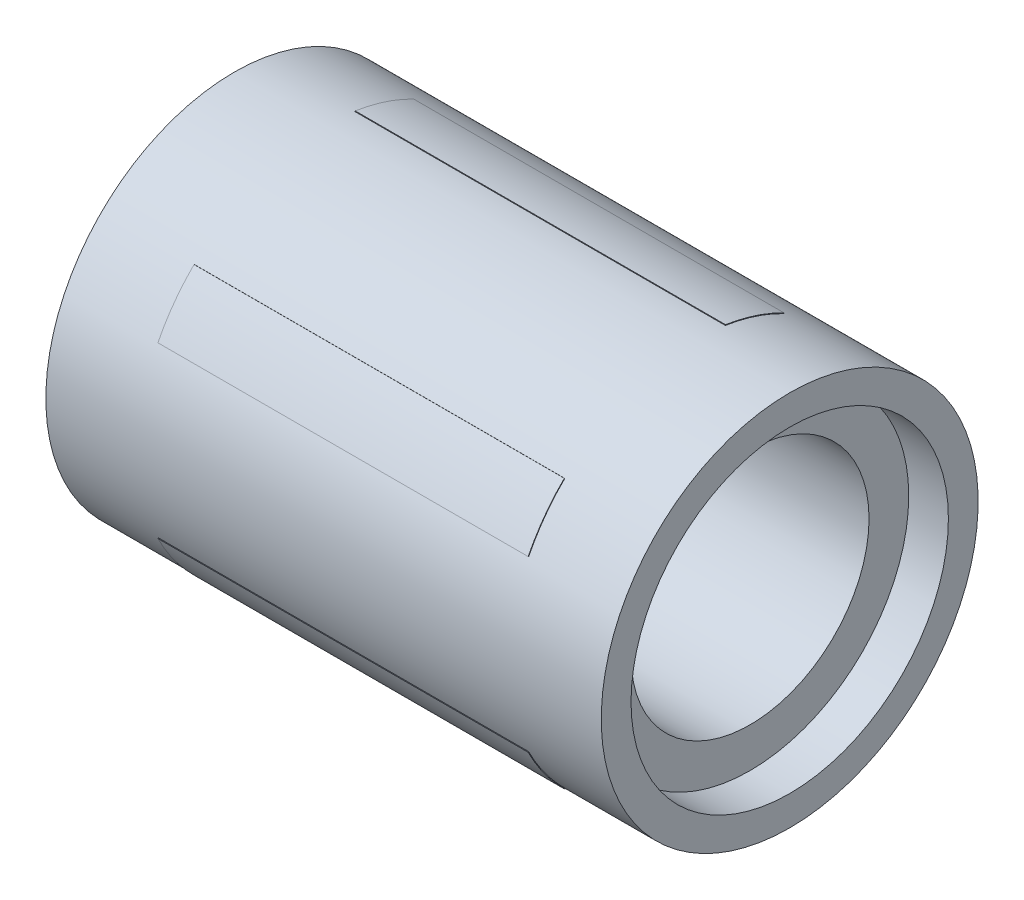
ISO-10303-21;
HEADER;
FILE_DESCRIPTION(('STEP AP214'),'2;1');
FILE_NAME('part.step','',(''),(''),'','','');
FILE_SCHEMA(('AUTOMOTIVE_DESIGN { 1 0 10303 214 1 1 1 1 }'));
ENDSEC;
DATA;
#1=APPLICATION_CONTEXT('core data for automotive mechanical design processes');
#2=APPLICATION_PROTOCOL_DEFINITION('international standard','automotive_design',2000,#1);
#3=PRODUCT_CONTEXT('',#1,'mechanical');
#4=PRODUCT('Part','Part','',(#3));
#5=PRODUCT_RELATED_PRODUCT_CATEGORY('part','',(#4));
#6=PRODUCT_DEFINITION_FORMATION('','',#4);
#7=PRODUCT_DEFINITION_CONTEXT('part definition',#1,'design');
#8=PRODUCT_DEFINITION('design','',#6,#7);
#9=PRODUCT_DEFINITION_SHAPE('','',#8);
#10=(LENGTH_UNIT() NAMED_UNIT(*) SI_UNIT(.MILLI.,.METRE.));
#11=(NAMED_UNIT(*) PLANE_ANGLE_UNIT() SI_UNIT($,.RADIAN.));
#12=(NAMED_UNIT(*) SI_UNIT($,.STERADIAN.) SOLID_ANGLE_UNIT());
#13=UNCERTAINTY_MEASURE_WITH_UNIT(LENGTH_MEASURE(1.E-05),#10,'distance_accuracy_value','');
#14=(GEOMETRIC_REPRESENTATION_CONTEXT(3) GLOBAL_UNCERTAINTY_ASSIGNED_CONTEXT((#13)) GLOBAL_UNIT_ASSIGNED_CONTEXT((#10,
#11,#12)) REPRESENTATION_CONTEXT('',''));
#15=CARTESIAN_POINT('',(0.,0.,0.));
#16=DIRECTION('',(0.,0.,1.));
#17=DIRECTION('',(1.,0.,0.));
#18=AXIS2_PLACEMENT_3D('',#15,#16,#17);
#19=CARTESIAN_POINT('',(-9.33333333333333,-1.55,-9.53094380169321));
#20=DIRECTION('',(-1.,0.,0.));
#21=DIRECTION('',(0.,0.,1.));
#22=AXIS2_PLACEMENT_3D('',#19,#20,#21);
#23=PLANE('',#22);
#24=DIRECTION('',(0.,0.,1.));
#25=VECTOR('',#24,1.);
#26=CARTESIAN_POINT('',(-9.33333333333333,-1.55,-9.45134985889871));
#27=LINE('',#26,#25);
#28=CARTESIAN_POINT('',(-9.33333333333333,-1.55,-9.40310586987087));
#29=VERTEX_POINT('',#28);
#30=CARTESIAN_POINT('',(-9.33333333333329,-1.55000000000001,-9.37269971779743));
#31=VERTEX_POINT('',#30);
#32=EDGE_CURVE('E159',#29,#31,#27,.T.);
#33=ORIENTED_EDGE('',*,*,#32,.T.);
#34=CARTESIAN_POINT('',(-9.33333333333324,0.,0.));
#35=DIRECTION('',(1.,0.,0.));
#36=DIRECTION('',(0.,1.,0.));
#37=AXIS2_PLACEMENT_3D('',#34,#35,#36);
#38=CIRCLE('',#37,9.5);
#39=CARTESIAN_POINT('',(-9.33333333333329,1.55,-9.37269971779743));
#40=VERTEX_POINT('',#39);
#41=EDGE_CURVE('E20',#31,#40,#38,.T.);
#42=ORIENTED_EDGE('',*,*,#41,.T.);
#43=DIRECTION('',(0.,0.,-1.));
#44=VECTOR('',#43,1.);
#45=CARTESIAN_POINT('',(-9.33333333333333,1.55,-9.45134985889871));
#46=LINE('',#45,#44);
#47=CARTESIAN_POINT('',(-9.33333333333333,1.55,-9.40310586987087));
#48=VERTEX_POINT('',#47);
#49=EDGE_CURVE('E157',#40,#48,#46,.T.);
#50=ORIENTED_EDGE('',*,*,#49,.T.);
#51=CARTESIAN_POINT('',(-9.33333333333333,0.,0.));
#52=DIRECTION('',(-1.,0.,0.));
#53=DIRECTION('',(0.,0.,1.));
#54=AXIS2_PLACEMENT_3D('',#51,#52,#53);
#55=CIRCLE('',#54,9.53000000000008);
#56=EDGE_CURVE('E262',#29,#48,#55,.F.);
#57=ORIENTED_EDGE('',*,*,#56,.F.);
#58=EDGE_LOOP('',(#33,#42,#50,#57));
#59=FACE_BOUND('',#58,.T.);
#60=ADVANCED_FACE('F17',(#59),#23,.T.);
#61=CARTESIAN_POINT('',(9.33333333333333,-1.55,-9.37175591610421));
#62=DIRECTION('',(1.,0.,0.));
#63=DIRECTION('',(0.,0.,-1.));
#64=AXIS2_PLACEMENT_3D('',#61,#62,#63);
#65=PLANE('',#64);
#66=DIRECTION('',(0.,0.,-1.));
#67=VECTOR('',#66,1.);
#68=CARTESIAN_POINT('',(9.33333333333333,-1.55,-9.45134985889871));
#69=LINE('',#68,#67);
#70=CARTESIAN_POINT('',(9.33333333333328,-1.55000000000001,-9.37269971779743));
#71=VERTEX_POINT('',#70);
#72=CARTESIAN_POINT('',(9.33333333333333,-1.55,-9.40310586987087));
#73=VERTEX_POINT('',#72);
#74=EDGE_CURVE('E266',#71,#73,#69,.T.);
#75=ORIENTED_EDGE('',*,*,#74,.T.);
#76=CARTESIAN_POINT('',(9.33333333333333,0.,0.));
#77=DIRECTION('',(-1.,0.,0.));
#78=DIRECTION('',(0.,0.,1.));
#79=AXIS2_PLACEMENT_3D('',#76,#77,#78);
#80=CIRCLE('',#79,9.53000000000008);
#81=CARTESIAN_POINT('',(9.33333333333333,1.55,-9.40310586987087));
#82=VERTEX_POINT('',#81);
#83=EDGE_CURVE('E259',#82,#73,#80,.T.);
#84=ORIENTED_EDGE('',*,*,#83,.F.);
#85=DIRECTION('',(0.,0.,1.));
#86=VECTOR('',#85,1.);
#87=CARTESIAN_POINT('',(9.33333333333333,1.55,-9.45134985889871));
#88=LINE('',#87,#86);
#89=CARTESIAN_POINT('',(9.33333333333328,1.55,-9.37269971779743));
#90=VERTEX_POINT('',#89);
#91=EDGE_CURVE('E160',#82,#90,#88,.T.);
#92=ORIENTED_EDGE('',*,*,#91,.T.);
#93=CARTESIAN_POINT('',(9.33333333333324,0.,0.));
#94=DIRECTION('',(1.,0.,0.));
#95=DIRECTION('',(0.,1.,0.));
#96=AXIS2_PLACEMENT_3D('',#93,#94,#95);
#97=CIRCLE('',#96,9.5);
#98=EDGE_CURVE('E173',#90,#71,#97,.F.);
#99=ORIENTED_EDGE('',*,*,#98,.T.);
#100=EDGE_LOOP('',(#75,#84,#92,#99));
#101=FACE_BOUND('',#100,.T.);
#102=ADVANCED_FACE('F734',(#101),#65,.T.);
#103=CARTESIAN_POINT('',(12.,-8.09600000000001,8.096));
#104=DIRECTION('',(1.,0.,0.));
#105=DIRECTION('',(0.,0.,-1.));
#106=AXIS2_PLACEMENT_3D('',#103,#104,#105);
#107=PLANE('',#106);
#108=CARTESIAN_POINT('',(12.,0.,0.));
#109=DIRECTION('',(1.,0.,0.));
#110=DIRECTION('',(0.,0.,-1.));
#111=AXIS2_PLACEMENT_3D('',#108,#109,#110);
#112=CIRCLE('',#111,6.);
#113=CARTESIAN_POINT('',(12.,0.,-6.));
#114=VERTEX_POINT('',#113);
#115=EDGE_CURVE('E256',#114,#114,#112,.T.);
#116=ORIENTED_EDGE('',*,*,#115,.F.);
#117=EDGE_LOOP('',(#116));
#118=FACE_BOUND('',#117,.T.);
#119=CARTESIAN_POINT('',(12.,0.,0.));
#120=DIRECTION('',(1.,0.,0.));
#121=DIRECTION('',(0.,0.,-1.));
#122=AXIS2_PLACEMENT_3D('',#119,#120,#121);
#123=CIRCLE('',#122,8.);
#124=CARTESIAN_POINT('',(12.,0.,-8.));
#125=VERTEX_POINT('',#124);
#126=EDGE_CURVE('E264',#125,#125,#123,.F.);
#127=ORIENTED_EDGE('',*,*,#126,.F.);
#128=EDGE_LOOP('',(#127));
#129=FACE_BOUND('',#128,.T.);
#130=ADVANCED_FACE('F725',(#118,#129),#107,.T.);
#131=CARTESIAN_POINT('',(12.,0.,0.));
#132=DIRECTION('',(1.,0.,0.));
#133=DIRECTION('',(0.,0.,-1.));
#134=AXIS2_PLACEMENT_3D('',#131,#132,#133);
#135=CYLINDRICAL_SURFACE('',#134,8.);
#136=CARTESIAN_POINT('',(14.,0.,0.));
#137=DIRECTION('',(1.,0.,0.));
#138=DIRECTION('',(0.,0.,-1.));
#139=AXIS2_PLACEMENT_3D('',#136,#137,#138);
#140=CIRCLE('',#139,8.);
#141=CARTESIAN_POINT('',(14.,0.,-8.));
#142=VERTEX_POINT('',#141);
#143=EDGE_CURVE('E252',#142,#142,#140,.F.);
#144=ORIENTED_EDGE('',*,*,#143,.F.);
#145=EDGE_LOOP('',(#144));
#146=FACE_BOUND('',#145,.T.);
#147=ORIENTED_EDGE('',*,*,#126,.T.);
#148=EDGE_LOOP('',(#147));
#149=FACE_BOUND('',#148,.T.);
#150=ADVANCED_FACE('F359',(#146,#149),#135,.F.);
#151=CARTESIAN_POINT('',(-9.33333333333333,0.,0.));
#152=DIRECTION('',(-1.,0.,0.));
#153=DIRECTION('',(0.,0.,1.));
#154=AXIS2_PLACEMENT_3D('',#151,#152,#153);
#155=CYLINDRICAL_SURFACE('',#154,9.53000000000008);
#156=ORIENTED_EDGE('',*,*,#83,.T.);
#157=DIRECTION('',(1.,0.,0.));
#158=VECTOR('',#157,1.);
#159=CARTESIAN_POINT('',(-9.33333333333333,-1.55,-9.40310586987087));
#160=LINE('',#159,#158);
#161=EDGE_CURVE('E255',#29,#73,#160,.T.);
#162=ORIENTED_EDGE('',*,*,#161,.F.);
#163=ORIENTED_EDGE('',*,*,#56,.T.);
#164=DIRECTION('',(1.,0.,0.));
#165=VECTOR('',#164,1.);
#166=CARTESIAN_POINT('',(-9.33333333333333,1.55,-9.40310586987087));
#167=LINE('',#166,#165);
#168=EDGE_CURVE('E168',#82,#48,#167,.F.);
#169=ORIENTED_EDGE('',*,*,#168,.F.);
#170=EDGE_LOOP('',(#156,#162,#163,#169));
#171=FACE_BOUND('',#170,.T.);
#172=ADVANCED_FACE('F349',(#171),#155,.T.);
#173=CARTESIAN_POINT('',(-9.33333333333333,2.2E-13,0.));
#174=DIRECTION('',(-1.,0.,0.));
#175=DIRECTION('',(0.,0.,1.));
#176=AXIS2_PLACEMENT_3D('',#173,#174,#175);
#177=CYLINDRICAL_SURFACE('',#176,9.53000000000023);
#178=CARTESIAN_POINT('',(9.33333333333333,2.2E-13,0.));
#179=DIRECTION('',(-1.,0.,0.));
#180=DIRECTION('',(0.,0.,1.));
#181=AXIS2_PLACEMENT_3D('',#178,#179,#180);
#182=CIRCLE('',#181,9.53000000000023);
#183=CARTESIAN_POINT('',(9.33333333333333,-9.42186145223507,-1.43158191343943));
#184=VERTEX_POINT('',#183);
#185=CARTESIAN_POINT('',(9.33333333333333,-8.46390876967273,-4.37985711395441));
#186=VERTEX_POINT('',#185);
#187=EDGE_CURVE('E249',#184,#186,#182,.F.);
#188=ORIENTED_EDGE('',*,*,#187,.F.);
#189=DIRECTION('',(1.,0.,0.));
#190=VECTOR('',#189,1.);
#191=CARTESIAN_POINT('',(-9.33333333333334,-9.42186145223507,-1.43158191343943));
#192=LINE('',#191,#190);
#193=CARTESIAN_POINT('',(-9.33333333333334,-9.42186145223507,-1.43158191343943));
#194=VERTEX_POINT('',#193);
#195=EDGE_CURVE('E278',#194,#184,#192,.T.);
#196=ORIENTED_EDGE('',*,*,#195,.F.);
#197=CARTESIAN_POINT('',(-9.33333333333333,2.2E-13,0.));
#198=DIRECTION('',(-1.,0.,0.));
#199=DIRECTION('',(0.,0.,1.));
#200=AXIS2_PLACEMENT_3D('',#197,#198,#199);
#201=CIRCLE('',#200,9.53000000000023);
#202=CARTESIAN_POINT('',(-9.33333333333334,-8.46390876967273,-4.3798571139544));
#203=VERTEX_POINT('',#202);
#204=EDGE_CURVE('E245',#203,#194,#201,.T.);
#205=ORIENTED_EDGE('',*,*,#204,.F.);
#206=DIRECTION('',(1.,0.,0.));
#207=VECTOR('',#206,1.);
#208=CARTESIAN_POINT('',(-9.33333333333334,-8.46390876967273,-4.37985711395441));
#209=LINE('',#208,#207);
#210=EDGE_CURVE('E276',#186,#203,#209,.F.);
#211=ORIENTED_EDGE('',*,*,#210,.F.);
#212=EDGE_LOOP('',(#188,#196,#205,#211));
#213=FACE_BOUND('',#212,.T.);
#214=ADVANCED_FACE('F346',(#213),#177,.T.);
#215=CARTESIAN_POINT('',(-9.33333333333333,0.,0.));
#216=DIRECTION('',(-1.,0.,0.));
#217=DIRECTION('',(0.,0.,1.));
#218=AXIS2_PLACEMENT_3D('',#215,#216,#217);
#219=CYLINDRICAL_SURFACE('',#218,9.53000000000008);
#220=CARTESIAN_POINT('',(9.33333333333333,0.,0.));
#221=DIRECTION('',(-1.,0.,0.));
#222=DIRECTION('',(0.,0.,1.));
#223=AXIS2_PLACEMENT_3D('',#220,#221,#222);
#224=CIRCLE('',#223,9.53000000000008);
#225=CARTESIAN_POINT('',(9.33333333333333,-4.27303061477372,8.51833958968569));
#226=VERTEX_POINT('',#225);
#227=CARTESIAN_POINT('',(9.33333333333333,-6.78098329733605,6.69620530757903));
#228=VERTEX_POINT('',#227);
#229=EDGE_CURVE('E241',#226,#228,#224,.F.);
#230=ORIENTED_EDGE('',*,*,#229,.F.);
#231=DIRECTION('',(1.,0.,0.));
#232=VECTOR('',#231,1.);
#233=CARTESIAN_POINT('',(-9.33333333333333,-4.27303061477372,8.51833958968569));
#234=LINE('',#233,#232);
#235=CARTESIAN_POINT('',(-9.33333333333333,-4.27303061477372,8.51833958968569));
#236=VERTEX_POINT('',#235);
#237=EDGE_CURVE('E283',#236,#226,#234,.T.);
#238=ORIENTED_EDGE('',*,*,#237,.F.);
#239=CARTESIAN_POINT('',(-9.33333333333333,0.,0.));
#240=DIRECTION('',(-1.,0.,0.));
#241=DIRECTION('',(0.,0.,1.));
#242=AXIS2_PLACEMENT_3D('',#239,#240,#241);
#243=CIRCLE('',#242,9.53000000000008);
#244=CARTESIAN_POINT('',(-9.33333333333333,-6.78098329733606,6.69620530757902));
#245=VERTEX_POINT('',#244);
#246=EDGE_CURVE('E237',#245,#236,#243,.T.);
#247=ORIENTED_EDGE('',*,*,#246,.F.);
#248=DIRECTION('',(1.,0.,0.));
#249=VECTOR('',#248,1.);
#250=CARTESIAN_POINT('',(-9.33333333333333,-6.78098329733605,6.69620530757903));
#251=LINE('',#250,#249);
#252=EDGE_CURVE('E281',#228,#245,#251,.F.);
#253=ORIENTED_EDGE('',*,*,#252,.F.);
#254=EDGE_LOOP('',(#230,#238,#247,#253));
#255=FACE_BOUND('',#254,.T.);
#256=ADVANCED_FACE('F348',(#255),#219,.T.);
#257=CARTESIAN_POINT('',(-9.33333333333333,0.,0.));
#258=DIRECTION('',(-1.,0.,0.));
#259=DIRECTION('',(0.,0.,1.));
#260=AXIS2_PLACEMENT_3D('',#257,#258,#259);
#261=CYLINDRICAL_SURFACE('',#260,9.53000000000003);
#262=CARTESIAN_POINT('',(9.33333333333333,0.,0.));
#263=DIRECTION('',(-1.,0.,0.));
#264=DIRECTION('',(0.,0.,1.));
#265=AXIS2_PLACEMENT_3D('',#262,#263,#264);
#266=CIRCLE('',#265,9.53000000000003);
#267=CARTESIAN_POINT('',(9.33333333333333,6.78098329733605,6.69620530757902));
#268=VERTEX_POINT('',#267);
#269=CARTESIAN_POINT('',(9.33333333333333,4.27303061477371,8.51833958968569));
#270=VERTEX_POINT('',#269);
#271=EDGE_CURVE('E233',#268,#270,#266,.F.);
#272=ORIENTED_EDGE('',*,*,#271,.F.);
#273=DIRECTION('',(1.,0.,0.));
#274=VECTOR('',#273,1.);
#275=CARTESIAN_POINT('',(-9.33333333333334,6.78098329733605,6.69620530757902));
#276=LINE('',#275,#274);
#277=CARTESIAN_POINT('',(-9.33333333333334,6.78098329733605,6.69620530757902));
#278=VERTEX_POINT('',#277);
#279=EDGE_CURVE('E288',#278,#268,#276,.T.);
#280=ORIENTED_EDGE('',*,*,#279,.F.);
#281=CARTESIAN_POINT('',(-9.33333333333333,0.,0.));
#282=DIRECTION('',(-1.,0.,0.));
#283=DIRECTION('',(0.,0.,1.));
#284=AXIS2_PLACEMENT_3D('',#281,#282,#283);
#285=CIRCLE('',#284,9.53000000000003);
#286=CARTESIAN_POINT('',(-9.33333333333333,4.2730306147737,8.5183395896857));
#287=VERTEX_POINT('',#286);
#288=EDGE_CURVE('E229',#287,#278,#285,.T.);
#289=ORIENTED_EDGE('',*,*,#288,.F.);
#290=DIRECTION('',(1.,0.,0.));
#291=VECTOR('',#290,1.);
#292=CARTESIAN_POINT('',(-9.33333333333333,4.27303061477371,8.51833958968569));
#293=LINE('',#292,#291);
#294=EDGE_CURVE('E286',#270,#287,#293,.F.);
#295=ORIENTED_EDGE('',*,*,#294,.F.);
#296=EDGE_LOOP('',(#272,#280,#289,#295));
#297=FACE_BOUND('',#296,.T.);
#298=ADVANCED_FACE('F356',(#297),#261,.T.);
#299=CARTESIAN_POINT('',(-9.33333333333333,0.,0.));
#300=DIRECTION('',(-1.,0.,0.));
#301=DIRECTION('',(0.,0.,1.));
#302=AXIS2_PLACEMENT_3D('',#299,#300,#301);
#303=CYLINDRICAL_SURFACE('',#302,9.53000000000002);
#304=CARTESIAN_POINT('',(9.33333333333333,0.,0.));
#305=DIRECTION('',(-1.,0.,0.));
#306=DIRECTION('',(0.,0.,1.));
#307=AXIS2_PLACEMENT_3D('',#304,#305,#306);
#308=CIRCLE('',#307,9.53000000000002);
#309=CARTESIAN_POINT('',(9.33333333333333,8.46390876967273,-4.37985711395441));
#310=VERTEX_POINT('',#309);
#311=CARTESIAN_POINT('',(9.33333333333333,9.42186145223507,-1.43158191343943));
#312=VERTEX_POINT('',#311);
#313=EDGE_CURVE('E225',#310,#312,#308,.F.);
#314=ORIENTED_EDGE('',*,*,#313,.F.);
#315=DIRECTION('',(1.,0.,0.));
#316=VECTOR('',#315,1.);
#317=CARTESIAN_POINT('',(-9.33333333333334,8.46390876967273,-4.37985711395441));
#318=LINE('',#317,#316);
#319=CARTESIAN_POINT('',(-9.33333333333334,8.46390876967273,-4.37985711395441));
#320=VERTEX_POINT('',#319);
#321=EDGE_CURVE('E293',#320,#310,#318,.T.);
#322=ORIENTED_EDGE('',*,*,#321,.F.);
#323=CARTESIAN_POINT('',(-9.33333333333333,0.,0.));
#324=DIRECTION('',(-1.,0.,0.));
#325=DIRECTION('',(0.,0.,1.));
#326=AXIS2_PLACEMENT_3D('',#323,#324,#325);
#327=CIRCLE('',#326,9.53000000000002);
#328=CARTESIAN_POINT('',(-9.33333333333333,9.42186145223507,-1.43158191343943));
#329=VERTEX_POINT('',#328);
#330=EDGE_CURVE('E222',#329,#320,#327,.T.);
#331=ORIENTED_EDGE('',*,*,#330,.F.);
#332=DIRECTION('',(1.,0.,0.));
#333=VECTOR('',#332,1.);
#334=CARTESIAN_POINT('',(-9.33333333333333,9.42186145223507,-1.43158191343943));
#335=LINE('',#334,#333);
#336=EDGE_CURVE('E291',#312,#329,#335,.F.);
#337=ORIENTED_EDGE('',*,*,#336,.F.);
#338=EDGE_LOOP('',(#314,#322,#331,#337));
#339=FACE_BOUND('',#338,.T.);
#340=ADVANCED_FACE('F528',(#339),#303,.T.);
#341=CARTESIAN_POINT('',(-12.,0.,0.));
#342=DIRECTION('',(1.,0.,0.));
#343=DIRECTION('',(0.,0.,-1.));
#344=AXIS2_PLACEMENT_3D('',#341,#342,#343);
#345=CYLINDRICAL_SURFACE('',#344,6.);
#346=ORIENTED_EDGE('',*,*,#115,.T.);
#347=EDGE_LOOP('',(#346));
#348=FACE_BOUND('',#347,.T.);
#349=CARTESIAN_POINT('',(-12.,0.,0.));
#350=DIRECTION('',(1.,0.,0.));
#351=DIRECTION('',(0.,0.,-1.));
#352=AXIS2_PLACEMENT_3D('',#349,#350,#351);
#353=CIRCLE('',#352,6.);
#354=CARTESIAN_POINT('',(-12.,0.,-6.));
#355=VERTEX_POINT('',#354);
#356=EDGE_CURVE('E218',#355,#355,#353,.T.);
#357=ORIENTED_EDGE('',*,*,#356,.F.);
#358=EDGE_LOOP('',(#357));
#359=FACE_BOUND('',#358,.T.);
#360=ADVANCED_FACE('F524',(#348,#359),#345,.F.);
#361=CARTESIAN_POINT('',(-9.33333333333333,-1.55,-9.37269971779743));
#362=DIRECTION('',(0.,-1.,0.));
#363=DIRECTION('',(0.,0.,-1.));
#364=AXIS2_PLACEMENT_3D('',#361,#362,#363);
#365=PLANE('',#364);
#366=ORIENTED_EDGE('',*,*,#161,.T.);
#367=ORIENTED_EDGE('',*,*,#74,.F.);
#368=DIRECTION('',(1.,0.,0.));
#369=VECTOR('',#368,1.);
#370=CARTESIAN_POINT('',(0.,-1.55000000000004,-9.37269971779742));
#371=LINE('',#370,#369);
#372=EDGE_CURVE('E181',#31,#71,#371,.T.);
#373=ORIENTED_EDGE('',*,*,#372,.F.);
#374=ORIENTED_EDGE('',*,*,#32,.F.);
#375=EDGE_LOOP('',(#366,#367,#373,#374));
#376=FACE_BOUND('',#375,.T.);
#377=ADVANCED_FACE('F520',(#376),#365,.T.);
#378=CARTESIAN_POINT('',(14.,-9.61400000000001,9.614));
#379=DIRECTION('',(1.,0.,0.));
#380=DIRECTION('',(0.,0.,-1.));
#381=AXIS2_PLACEMENT_3D('',#378,#379,#380);
#382=PLANE('',#381);
#383=ORIENTED_EDGE('',*,*,#143,.T.);
#384=EDGE_LOOP('',(#383));
#385=FACE_BOUND('',#384,.T.);
#386=CARTESIAN_POINT('',(14.,0.,0.));
#387=DIRECTION('',(1.,0.,0.));
#388=DIRECTION('',(0.,1.,0.));
#389=AXIS2_PLACEMENT_3D('',#386,#387,#388);
#390=CIRCLE('',#389,9.5);
#391=CARTESIAN_POINT('',(14.,9.5,0.));
#392=VERTEX_POINT('',#391);
#393=EDGE_CURVE('E175',#392,#392,#390,.F.);
#394=ORIENTED_EDGE('',*,*,#393,.F.);
#395=EDGE_LOOP('',(#394));
#396=FACE_BOUND('',#395,.T.);
#397=ADVANCED_FACE('F517',(#385,#396),#382,.T.);
#398=CARTESIAN_POINT('',(-9.33333333333333,1.55,-9.40310586987087));
#399=DIRECTION('',(0.,1.,0.));
#400=DIRECTION('',(0.,0.,1.));
#401=AXIS2_PLACEMENT_3D('',#398,#399,#400);
#402=PLANE('',#401);
#403=ORIENTED_EDGE('',*,*,#168,.T.);
#404=ORIENTED_EDGE('',*,*,#49,.F.);
#405=DIRECTION('',(-1.,0.,0.));
#406=VECTOR('',#405,1.);
#407=CARTESIAN_POINT('',(0.,1.54999999999998,-9.37269971779743));
#408=LINE('',#407,#406);
#409=EDGE_CURVE('E165',#90,#40,#408,.T.);
#410=ORIENTED_EDGE('',*,*,#409,.F.);
#411=ORIENTED_EDGE('',*,*,#91,.F.);
#412=EDGE_LOOP('',(#403,#404,#410,#411));
#413=FACE_BOUND('',#412,.T.);
#414=ADVANCED_FACE('F164',(#413),#402,.T.);
#415=CARTESIAN_POINT('',(9.33333333333333,-9.42778267594218,-1.40443986840575));
#416=DIRECTION('',(1.,0.,0.));
#417=DIRECTION('',(0.,0.,-1.));
#418=AXIS2_PLACEMENT_3D('',#415,#416,#417);
#419=PLANE('',#418);
#420=DIRECTION('',(0.,0.951056516295179,0.30901699437487));
#421=VECTOR('',#420,1.);
#422=CARTESIAN_POINT('',(9.33333333333333,-9.40740246770261,-1.42688390457731));
#423=LINE('',#422,#421);
#424=CARTESIAN_POINT('',(9.33333333333328,-9.39294348317016,-1.42218589571521));
#425=VERTEX_POINT('',#424);
#426=EDGE_CURVE('E244',#184,#425,#423,.T.);
#427=ORIENTED_EDGE('',*,*,#426,.F.);
#428=ORIENTED_EDGE('',*,*,#187,.T.);
#429=DIRECTION('',(0.,-0.951056516295094,-0.30901699437513));
#430=VECTOR('',#429,1.);
#431=CARTESIAN_POINT('',(9.33333333333333,-8.44944978514027,-4.37515910509229));
#432=LINE('',#431,#430);
#433=CARTESIAN_POINT('',(9.33333333333328,-8.43499080060783,-4.37046109623016));
#434=VERTEX_POINT('',#433);
#435=EDGE_CURVE('E251',#434,#186,#432,.T.);
#436=ORIENTED_EDGE('',*,*,#435,.F.);
#437=CARTESIAN_POINT('',(9.33333333333324,0.,0.));
#438=DIRECTION('',(1.,0.,0.));
#439=DIRECTION('',(0.,1.,0.));
#440=AXIS2_PLACEMENT_3D('',#437,#438,#439);
#441=CIRCLE('',#440,9.5);
#442=EDGE_CURVE('E174',#425,#434,#441,.T.);
#443=ORIENTED_EDGE('',*,*,#442,.F.);
#444=EDGE_LOOP('',(#427,#428,#436,#443));
#445=FACE_BOUND('',#444,.T.);
#446=ADVANCED_FACE('F338',(#445),#419,.T.);
#447=CARTESIAN_POINT('',(-9.33333333333334,-8.46390876967273,-4.37985711395441));
#448=DIRECTION('',(0.,0.30901699437513,-0.951056516295094));
#449=DIRECTION('',(0.,0.951056516295094,0.30901699437513));
#450=AXIS2_PLACEMENT_3D('',#447,#448,#449);
#451=PLANE('',#450);
#452=ORIENTED_EDGE('',*,*,#210,.T.);
#453=CARTESIAN_POINT('',(-9.33333333333333,-8.43499080060782,-4.37046109623015));
#454=CARTESIAN_POINT('',(-9.33333333333333,-8.43619571598553,-4.37085259696866));
#455=CARTESIAN_POINT('',(-9.33333333333333,-8.43740063136323,-4.37124409770718));
#456=CARTESIAN_POINT('',(-9.33333333333333,-8.43981046211864,-4.3720270991842));
#457=CARTESIAN_POINT('',(-9.33333333333333,-8.44101537749635,-4.37241859992271));
#458=CARTESIAN_POINT('',(-9.33333333333333,-8.44342520825175,-4.37320160139973));
#459=CARTESIAN_POINT('',(-9.33333333333333,-8.44463012362946,-4.37359310213824));
#460=CARTESIAN_POINT('',(-9.33333333333333,-8.44703995438487,-4.37437610361526));
#461=CARTESIAN_POINT('',(-9.33333333333333,-8.44824486976257,-4.37476760435377));
#462=CARTESIAN_POINT('',(-9.33333333333333,-8.45065470051798,-4.37555060583079));
#463=CARTESIAN_POINT('',(-9.33333333333333,-8.45185961589569,-4.3759421065693));
#464=CARTESIAN_POINT('',(-9.33333333333333,-8.45426944665109,-4.37672510804632));
#465=CARTESIAN_POINT('',(-9.33333333333333,-8.4554743620288,-4.37711660878483));
#466=CARTESIAN_POINT('',(-9.33333333333333,-8.45788419278421,-4.37789961026185));
#467=CARTESIAN_POINT('',(-9.33333333333333,-8.45908910816191,-4.37829111100037));
#468=CARTESIAN_POINT('',(-9.33333333333333,-8.46149893891732,-4.37907411247739));
#469=CARTESIAN_POINT('',(-9.33333333333333,-8.46270385429503,-4.3794656132159));
#470=CARTESIAN_POINT('',(-9.33333333333333,-8.46390876967273,-4.37985711395441));
#471=B_SPLINE_CURVE_WITH_KNOTS('',3,(#453,#454,#455,#456,#457,#458,#459,#460,#461,#462,#463,
#464,#465,#466,#467,#468,#469,#470),.UNSPECIFIED.,.F.,.F.,(4,2,2,2,2,2,2,2,4),(0.,
0.00380076900917983,0.00760153801836132,0.0114023070275412,0.0152030760367207,
0.0190038450459005,0.022804614055082,0.0266053830642619,0.0304061520734433),.UNSPECIFIED.);
#472=CARTESIAN_POINT('',(-9.33333333333328,-8.43499081275889,-4.37046110017827));
#473=VERTEX_POINT('',#472);
#474=EDGE_CURVE('E248',#473,#203,#471,.T.);
#475=ORIENTED_EDGE('',*,*,#474,.F.);
#476=DIRECTION('',(-1.,0.,0.));
#477=VECTOR('',#476,1.);
#478=CARTESIAN_POINT('',(0.,-8.43499080060783,-4.37046109623015));
#479=LINE('',#478,#477);
#480=EDGE_CURVE('E178',#434,#473,#479,.T.);
#481=ORIENTED_EDGE('',*,*,#480,.F.);
#482=ORIENTED_EDGE('',*,*,#435,.T.);
#483=EDGE_LOOP('',(#452,#475,#481,#482));
#484=FACE_BOUND('',#483,.T.);
#485=ADVANCED_FACE('F342',(#484),#451,.T.);
#486=CARTESIAN_POINT('',(-9.33333333333333,-9.42778267599902,-4.39760314126384));
#487=DIRECTION('',(-1.,0.,0.));
#488=DIRECTION('',(0.,0.,1.));
#489=AXIS2_PLACEMENT_3D('',#486,#487,#488);
#490=PLANE('',#489);
#491=ORIENTED_EDGE('',*,*,#204,.T.);
#492=DIRECTION('',(0.,-0.951056516295179,-0.30901699437487));
#493=VECTOR('',#492,1.);
#494=CARTESIAN_POINT('',(-9.33333333333334,-9.40740246770261,-1.42688390457731));
#495=LINE('',#494,#493);
#496=CARTESIAN_POINT('',(-9.33333333333329,-9.39294348317016,-1.42218589571521));
#497=VERTEX_POINT('',#496);
#498=EDGE_CURVE('E247',#497,#194,#495,.T.);
#499=ORIENTED_EDGE('',*,*,#498,.F.);
#500=CARTESIAN_POINT('',(-9.33333333333324,0.,0.));
#501=DIRECTION('',(1.,0.,0.));
#502=DIRECTION('',(0.,1.,0.));
#503=AXIS2_PLACEMENT_3D('',#500,#501,#502);
#504=CIRCLE('',#503,9.5);
#505=EDGE_CURVE('E215',#473,#497,#504,.F.);
#506=ORIENTED_EDGE('',*,*,#505,.F.);
#507=ORIENTED_EDGE('',*,*,#474,.T.);
#508=EDGE_LOOP('',(#491,#499,#506,#507));
#509=FACE_BOUND('',#508,.T.);
#510=ADVANCED_FACE('F316',(#509),#490,.T.);
#511=CARTESIAN_POINT('',(-9.33333333333334,-9.39294348317016,-1.42218589571519));
#512=DIRECTION('',(0.,-0.30901699437487,0.951056516295179));
#513=DIRECTION('',(0.,-0.951056516295179,-0.30901699437487));
#514=AXIS2_PLACEMENT_3D('',#511,#512,#513);
#515=PLANE('',#514);
#516=ORIENTED_EDGE('',*,*,#195,.T.);
#517=ORIENTED_EDGE('',*,*,#426,.T.);
#518=DIRECTION('',(1.,0.,0.));
#519=VECTOR('',#518,1.);
#520=CARTESIAN_POINT('',(0.,-9.39294348317016,-1.42218589571522));
#521=LINE('',#520,#519);
#522=EDGE_CURVE('E214',#497,#425,#521,.T.);
#523=ORIENTED_EDGE('',*,*,#522,.F.);
#524=ORIENTED_EDGE('',*,*,#498,.T.);
#525=EDGE_LOOP('',(#516,#517,#523,#524));
#526=FACE_BOUND('',#525,.T.);
#527=ADVANCED_FACE('F314',(#526),#515,.T.);
#528=CARTESIAN_POINT('',(9.33333333333333,-6.79613824692211,8.5294199899409));
#529=DIRECTION('',(1.,0.,0.));
#530=DIRECTION('',(0.,0.,-1.));
#531=AXIS2_PLACEMENT_3D('',#528,#529,#530);
#532=PLANE('',#531);
#533=DIRECTION('',(0.,0.587785252292749,-0.809016994374747));
#534=VECTOR('',#533,1.);
#535=CARTESIAN_POINT('',(9.33333333333333,-4.26409447088985,8.50604004280521));
#536=LINE('',#535,#534);
#537=CARTESIAN_POINT('',(9.33333333333328,-4.25515832700598,8.49374049592473));
#538=VERTEX_POINT('',#537);
#539=EDGE_CURVE('E236',#226,#538,#536,.T.);
#540=ORIENTED_EDGE('',*,*,#539,.F.);
#541=ORIENTED_EDGE('',*,*,#229,.T.);
#542=DIRECTION('',(0.,-0.587785252292334,0.809016994375049));
#543=VECTOR('',#542,1.);
#544=CARTESIAN_POINT('',(9.33333333333333,-6.77204715345218,6.68390576069855));
#545=LINE('',#544,#543);
#546=CARTESIAN_POINT('',(9.33333333333328,-6.76311100956832,6.67160621381807));
#547=VERTEX_POINT('',#546);
#548=EDGE_CURVE('E243',#547,#228,#545,.T.);
#549=ORIENTED_EDGE('',*,*,#548,.F.);
#550=CARTESIAN_POINT('',(9.33333333333324,0.,0.));
#551=DIRECTION('',(1.,0.,0.));
#552=DIRECTION('',(0.,1.,0.));
#553=AXIS2_PLACEMENT_3D('',#550,#551,#552);
#554=CIRCLE('',#553,9.5);
#555=EDGE_CURVE('E211',#538,#547,#554,.T.);
#556=ORIENTED_EDGE('',*,*,#555,.F.);
#557=EDGE_LOOP('',(#540,#541,#549,#556));
#558=FACE_BOUND('',#557,.T.);
#559=ADVANCED_FACE('F477',(#558),#532,.T.);
#560=CARTESIAN_POINT('',(-9.33333333333333,-6.78098329733605,6.69620530757903));
#561=DIRECTION('',(0.,-0.809016994375049,-0.587785252292334));
#562=DIRECTION('',(0.,0.587785252292334,-0.809016994375049));
#563=AXIS2_PLACEMENT_3D('',#560,#561,#562);
#564=PLANE('',#563);
#565=ORIENTED_EDGE('',*,*,#252,.T.);
#566=CARTESIAN_POINT('',(-9.33333333333333,-6.76311100956833,6.67160621381807));
#567=CARTESIAN_POINT('',(-9.33333333333333,-6.76385568822531,6.6726311760581));
#568=CARTESIAN_POINT('',(-9.33333333333333,-6.7646003668823,6.67365613829814));
#569=CARTESIAN_POINT('',(-9.33333333333333,-6.76608972419628,6.67570606277822));
#570=CARTESIAN_POINT('',(-9.33333333333333,-6.76683440285327,6.67673102501826));
#571=CARTESIAN_POINT('',(-9.33333333333333,-6.76832376016725,6.67878094949834));
#572=CARTESIAN_POINT('',(-9.33333333333333,-6.76906843882423,6.67980591173838));
#573=CARTESIAN_POINT('',(-9.33333333333333,-6.77055779613821,6.68185583621846));
#574=CARTESIAN_POINT('',(-9.33333333333333,-6.7713024747952,6.6828807984585));
#575=CARTESIAN_POINT('',(-9.33333333333333,-6.77279183210918,6.68493072293858));
#576=CARTESIAN_POINT('',(-9.33333333333333,-6.77353651076617,6.68595568517862));
#577=CARTESIAN_POINT('',(-9.33333333333333,-6.77502586808014,6.6880056096587));
#578=CARTESIAN_POINT('',(-9.33333333333333,-6.77577054673713,6.68903057189874));
#579=CARTESIAN_POINT('',(-9.33333333333333,-6.77725990405111,6.69108049637882));
#580=CARTESIAN_POINT('',(-9.33333333333333,-6.7780045827081,6.69210545861886));
#581=CARTESIAN_POINT('',(-9.33333333333333,-6.77949394002207,6.69415538309894));
#582=CARTESIAN_POINT('',(-9.33333333333333,-6.78023861867906,6.69518034533898));
#583=CARTESIAN_POINT('',(-9.33333333333333,-6.78098329733605,6.69620530757902));
#584=B_SPLINE_CURVE_WITH_KNOTS('',3,(#566,#567,#568,#569,#570,#571,#572,#573,#574,#575,#576,
#577,#578,#579,#580,#581,#582,#583),.UNSPECIFIED.,.F.,.F.,(4,2,2,2,2,2,2,2,4),(0.,
0.0038007690091782,0.00760153801835691,0.0114023070275363,0.0152030760367152,0.0190038450458939,
0.0228046140550728,0.0266053830642522,0.0304061520734316),.UNSPECIFIED.);
#585=CARTESIAN_POINT('',(-9.33333333333329,-6.76311102922832,6.67160624087775));
#586=VERTEX_POINT('',#585);
#587=EDGE_CURVE('E240',#586,#245,#584,.T.);
#588=ORIENTED_EDGE('',*,*,#587,.F.);
#589=DIRECTION('',(-1.,0.,0.));
#590=VECTOR('',#589,1.);
#591=CARTESIAN_POINT('',(0.,-6.7631110095683,6.67160621381809));
#592=LINE('',#591,#590);
#593=EDGE_CURVE('E210',#547,#586,#592,.T.);
#594=ORIENTED_EDGE('',*,*,#593,.F.);
#595=ORIENTED_EDGE('',*,*,#548,.T.);
#596=EDGE_LOOP('',(#565,#588,#594,#595));
#597=FACE_BOUND('',#596,.T.);
#598=ADVANCED_FACE('F471',(#597),#564,.T.);
#599=CARTESIAN_POINT('',(-9.33333333333333,-6.79613824692211,6.66052581356286));
#600=DIRECTION('',(-1.,0.,0.));
#601=DIRECTION('',(0.,0.,1.));
#602=AXIS2_PLACEMENT_3D('',#599,#600,#601);
#603=PLANE('',#602);
#604=ORIENTED_EDGE('',*,*,#246,.T.);
#605=DIRECTION('',(0.,-0.587785252292749,0.809016994374747));
#606=VECTOR('',#605,1.);
#607=CARTESIAN_POINT('',(-9.33333333333333,-4.26409447088985,8.50604004280521));
#608=LINE('',#607,#606);
#609=CARTESIAN_POINT('',(-9.33333333333328,-4.25515832700598,8.49374049592473));
#610=VERTEX_POINT('',#609);
#611=EDGE_CURVE('E239',#610,#236,#608,.T.);
#612=ORIENTED_EDGE('',*,*,#611,.F.);
#613=CARTESIAN_POINT('',(-9.33333333333324,0.,0.));
#614=DIRECTION('',(1.,0.,0.));
#615=DIRECTION('',(0.,1.,0.));
#616=AXIS2_PLACEMENT_3D('',#613,#614,#615);
#617=CIRCLE('',#616,9.5);
#618=EDGE_CURVE('E207',#586,#610,#617,.F.);
#619=ORIENTED_EDGE('',*,*,#618,.F.);
#620=ORIENTED_EDGE('',*,*,#587,.T.);
#621=EDGE_LOOP('',(#604,#612,#619,#620));
#622=FACE_BOUND('',#621,.T.);
#623=ADVANCED_FACE('F457',(#622),#603,.T.);
#624=CARTESIAN_POINT('',(-9.33333333333333,-4.25515832700598,8.49374049592473));
#625=DIRECTION('',(0.,0.809016994374747,0.587785252292749));
#626=DIRECTION('',(0.,-0.587785252292749,0.809016994374747));
#627=AXIS2_PLACEMENT_3D('',#624,#625,#626);
#628=PLANE('',#627);
#629=ORIENTED_EDGE('',*,*,#237,.T.);
#630=ORIENTED_EDGE('',*,*,#539,.T.);
#631=DIRECTION('',(1.,0.,0.));
#632=VECTOR('',#631,1.);
#633=CARTESIAN_POINT('',(0.,-4.25515832700598,8.49374049592473));
#634=LINE('',#633,#632);
#635=EDGE_CURVE('E206',#610,#538,#634,.T.);
#636=ORIENTED_EDGE('',*,*,#635,.F.);
#637=ORIENTED_EDGE('',*,*,#611,.T.);
#638=EDGE_LOOP('',(#629,#630,#636,#637));
#639=FACE_BOUND('',#638,.T.);
#640=ADVANCED_FACE('F455',(#639),#628,.T.);
#641=CARTESIAN_POINT('',(9.33333333333333,4.24000341049638,8.5294199899409));
#642=DIRECTION('',(1.,0.,0.));
#643=DIRECTION('',(0.,0.,-1.));
#644=AXIS2_PLACEMENT_3D('',#641,#642,#643);
#645=PLANE('',#644);
#646=DIRECTION('',(0.,-0.587785252292496,-0.809016994374931));
#647=VECTOR('',#646,1.);
#648=CARTESIAN_POINT('',(9.33333333333333,6.77204715345218,6.68390576069854));
#649=LINE('',#648,#647);
#650=CARTESIAN_POINT('',(9.33333333333328,6.76311100956832,6.67160621381806));
#651=VERTEX_POINT('',#650);
#652=EDGE_CURVE('E228',#268,#651,#649,.T.);
#653=ORIENTED_EDGE('',*,*,#652,.F.);
#654=ORIENTED_EDGE('',*,*,#271,.T.);
#655=DIRECTION('',(0.,0.58778525229232,0.809016994375059));
#656=VECTOR('',#655,1.);
#657=CARTESIAN_POINT('',(9.33333333333333,4.26409447088985,8.50604004280521));
#658=LINE('',#657,#656);
#659=CARTESIAN_POINT('',(9.33333333333328,4.25515832700597,8.49374049592473));
#660=VERTEX_POINT('',#659);
#661=EDGE_CURVE('E235',#660,#270,#658,.T.);
#662=ORIENTED_EDGE('',*,*,#661,.F.);
#663=CARTESIAN_POINT('',(9.33333333333324,0.,0.));
#664=DIRECTION('',(1.,0.,0.));
#665=DIRECTION('',(0.,1.,0.));
#666=AXIS2_PLACEMENT_3D('',#663,#664,#665);
#667=CIRCLE('',#666,9.5);
#668=EDGE_CURVE('E203',#651,#660,#667,.T.);
#669=ORIENTED_EDGE('',*,*,#668,.F.);
#670=EDGE_LOOP('',(#653,#654,#662,#669));
#671=FACE_BOUND('',#670,.T.);
#672=ADVANCED_FACE('F488',(#671),#645,.T.);
#673=CARTESIAN_POINT('',(-9.33333333333333,4.27303061477371,8.51833958968569));
#674=DIRECTION('',(0.,-0.809016994375059,0.58778525229232));
#675=DIRECTION('',(0.,-0.58778525229232,-0.809016994375059));
#676=AXIS2_PLACEMENT_3D('',#673,#674,#675);
#677=PLANE('',#676);
#678=ORIENTED_EDGE('',*,*,#294,.T.);
#679=CARTESIAN_POINT('',(-9.33333333333333,4.25515832700599,8.49374049592474));
#680=CARTESIAN_POINT('',(-9.33333333333333,4.25590300566298,8.49476545816478));
#681=CARTESIAN_POINT('',(-9.33333333333333,4.25664768431997,8.49579042040482));
#682=CARTESIAN_POINT('',(-9.33333333333333,4.25813704163394,8.4978403448849));
#683=CARTESIAN_POINT('',(-9.33333333333333,4.25888172029093,8.49886530712494));
#684=CARTESIAN_POINT('',(-9.33333333333333,4.26037107760491,8.50091523160502));
#685=CARTESIAN_POINT('',(-9.33333333333333,4.2611157562619,8.50194019384506));
#686=CARTESIAN_POINT('',(-9.33333333333333,4.26260511357587,8.50399011832514));
#687=CARTESIAN_POINT('',(-9.33333333333333,4.26334979223286,8.50501508056518));
#688=CARTESIAN_POINT('',(-9.33333333333333,4.26483914954684,8.50706500504526));
#689=CARTESIAN_POINT('',(-9.33333333333333,4.26558382820383,8.5080899672853));
#690=CARTESIAN_POINT('',(-9.33333333333333,4.2670731855178,8.51013989176538));
#691=CARTESIAN_POINT('',(-9.33333333333333,4.26781786417479,8.51116485400542));
#692=CARTESIAN_POINT('',(-9.33333333333333,4.26930722148877,8.5132147784855));
#693=CARTESIAN_POINT('',(-9.33333333333333,4.27005190014576,8.51423974072554));
#694=CARTESIAN_POINT('',(-9.33333333333333,4.27154125745974,8.51628966520562));
#695=CARTESIAN_POINT('',(-9.33333333333333,4.27228593611672,8.51731462744566));
#696=CARTESIAN_POINT('',(-9.33333333333333,4.27303061477371,8.5183395896857));
#697=B_SPLINE_CURVE_WITH_KNOTS('',3,(#679,#680,#681,#682,#683,#684,#685,#686,#687,#688,#689,
#690,#691,#692,#693,#694,#695,#696),.UNSPECIFIED.,.F.,.F.,(4,2,2,2,2,2,2,2,4),(0.,
0.0038007690091789,0.00760153801835831,0.0114023070275372,0.0152030760367152,0.0190038450458941,
0.0228046140550749,0.0266053830642524,0.0304061520734318),.UNSPECIFIED.);
#698=CARTESIAN_POINT('',(-9.33333333333329,4.25515834666597,8.49374052298442));
#699=VERTEX_POINT('',#698);
#700=EDGE_CURVE('E232',#699,#287,#697,.T.);
#701=ORIENTED_EDGE('',*,*,#700,.F.);
#702=DIRECTION('',(-1.,0.,0.));
#703=VECTOR('',#702,1.);
#704=CARTESIAN_POINT('',(0.,4.25515832700595,8.49374049592475));
#705=LINE('',#704,#703);
#706=EDGE_CURVE('E202',#660,#699,#705,.T.);
#707=ORIENTED_EDGE('',*,*,#706,.F.);
#708=ORIENTED_EDGE('',*,*,#661,.T.);
#709=EDGE_LOOP('',(#678,#701,#707,#708));
#710=FACE_BOUND('',#709,.T.);
#711=ADVANCED_FACE('F493',(#710),#677,.T.);
#712=CARTESIAN_POINT('',(-9.33333333333333,4.24000341673993,6.66052581356286));
#713=DIRECTION('',(-1.,0.,0.));
#714=DIRECTION('',(0.,0.,1.));
#715=AXIS2_PLACEMENT_3D('',#712,#713,#714);
#716=PLANE('',#715);
#717=ORIENTED_EDGE('',*,*,#288,.T.);
#718=DIRECTION('',(0.,0.587785252292496,0.809016994374931));
#719=VECTOR('',#718,1.);
#720=CARTESIAN_POINT('',(-9.33333333333334,6.77204715345218,6.68390576069854));
#721=LINE('',#720,#719);
#722=CARTESIAN_POINT('',(-9.33333333333329,6.76311100956832,6.67160621381806));
#723=VERTEX_POINT('',#722);
#724=EDGE_CURVE('E231',#723,#278,#721,.T.);
#725=ORIENTED_EDGE('',*,*,#724,.F.);
#726=CARTESIAN_POINT('',(-9.33333333333324,0.,0.));
#727=DIRECTION('',(1.,0.,0.));
#728=DIRECTION('',(0.,1.,0.));
#729=AXIS2_PLACEMENT_3D('',#726,#727,#728);
#730=CIRCLE('',#729,9.5);
#731=EDGE_CURVE('E199',#699,#723,#730,.F.);
#732=ORIENTED_EDGE('',*,*,#731,.F.);
#733=ORIENTED_EDGE('',*,*,#700,.T.);
#734=EDGE_LOOP('',(#717,#725,#732,#733));
#735=FACE_BOUND('',#734,.T.);
#736=ADVANCED_FACE('F427',(#735),#716,.T.);
#737=CARTESIAN_POINT('',(-9.33333333333334,6.76311100956832,6.67160621381806));
#738=DIRECTION('',(0.,0.80901699437493,-0.587785252292496));
#739=DIRECTION('',(0.,0.587785252292496,0.80901699437493));
#740=AXIS2_PLACEMENT_3D('',#737,#738,#739);
#741=PLANE('',#740);
#742=ORIENTED_EDGE('',*,*,#279,.T.);
#743=ORIENTED_EDGE('',*,*,#652,.T.);
#744=DIRECTION('',(1.,0.,0.));
#745=VECTOR('',#744,1.);
#746=CARTESIAN_POINT('',(0.,6.76311100956833,6.67160621381805));
#747=LINE('',#746,#745);
#748=EDGE_CURVE('E198',#723,#651,#747,.T.);
#749=ORIENTED_EDGE('',*,*,#748,.F.);
#750=ORIENTED_EDGE('',*,*,#724,.T.);
#751=EDGE_LOOP('',(#742,#743,#749,#750));
#752=FACE_BOUND('',#751,.T.);
#753=ADVANCED_FACE('F425',(#752),#741,.T.);
#754=CARTESIAN_POINT('',(9.33333333333333,8.42906960114599,-1.40443986840576));
#755=DIRECTION('',(1.,0.,0.));
#756=DIRECTION('',(0.,0.,-1.));
#757=AXIS2_PLACEMENT_3D('',#754,#755,#756);
#758=PLANE('',#757);
#759=DIRECTION('',(0.,-0.951056516295186,0.309016994374847));
#760=VECTOR('',#759,1.);
#761=CARTESIAN_POINT('',(9.33333333333333,8.44944978514027,-4.37515910509229));
#762=LINE('',#761,#760);
#763=CARTESIAN_POINT('',(9.33333333333328,8.43499080060783,-4.37046109623016));
#764=VERTEX_POINT('',#763);
#765=EDGE_CURVE('E221',#310,#764,#762,.T.);
#766=ORIENTED_EDGE('',*,*,#765,.F.);
#767=ORIENTED_EDGE('',*,*,#313,.T.);
#768=DIRECTION('',(0.,0.951056516295179,-0.30901699437487));
#769=VECTOR('',#768,1.);
#770=CARTESIAN_POINT('',(9.33333333333333,9.40740246770261,-1.42688390457731));
#771=LINE('',#770,#769);
#772=CARTESIAN_POINT('',(9.33333333333328,9.39294348317016,-1.42218589571519));
#773=VERTEX_POINT('',#772);
#774=EDGE_CURVE('E227',#773,#312,#771,.T.);
#775=ORIENTED_EDGE('',*,*,#774,.F.);
#776=CARTESIAN_POINT('',(9.33333333333324,0.,0.));
#777=DIRECTION('',(1.,0.,0.));
#778=DIRECTION('',(0.,1.,0.));
#779=AXIS2_PLACEMENT_3D('',#776,#777,#778);
#780=CIRCLE('',#779,9.5);
#781=EDGE_CURVE('E195',#764,#773,#780,.T.);
#782=ORIENTED_EDGE('',*,*,#781,.F.);
#783=EDGE_LOOP('',(#766,#767,#775,#782));
#784=FACE_BOUND('',#783,.T.);
#785=ADVANCED_FACE('F558',(#784),#758,.T.);
#786=CARTESIAN_POINT('',(-9.33333333333333,9.42186145223507,-1.43158191343943));
#787=DIRECTION('',(0.,0.30901699437487,0.951056516295179));
#788=DIRECTION('',(0.,-0.951056516295179,0.30901699437487));
#789=AXIS2_PLACEMENT_3D('',#786,#787,#788);
#790=PLANE('',#789);
#791=ORIENTED_EDGE('',*,*,#336,.T.);
#792=CARTESIAN_POINT('',(-9.33333333333333,9.39294348317016,-1.42218589571519));
#793=CARTESIAN_POINT('',(-9.33333333333333,9.39414839854787,-1.4225773964537));
#794=CARTESIAN_POINT('',(-9.33333333333333,9.39535331392557,-1.42296889719221));
#795=CARTESIAN_POINT('',(-9.33333333333333,9.39776314468098,-1.42375189866924));
#796=CARTESIAN_POINT('',(-9.33333333333333,9.39896806005869,-1.42414339940775));
#797=CARTESIAN_POINT('',(-9.33333333333333,9.40137789081409,-1.42492640088477));
#798=CARTESIAN_POINT('',(-9.33333333333333,9.4025828061918,-1.42531790162328));
#799=CARTESIAN_POINT('',(-9.33333333333333,9.40499263694721,-1.4261009031003));
#800=CARTESIAN_POINT('',(-9.33333333333333,9.40619755232491,-1.42649240383881));
#801=CARTESIAN_POINT('',(-9.33333333333333,9.40860738308032,-1.42727540531583));
#802=CARTESIAN_POINT('',(-9.33333333333333,9.40981229845803,-1.42766690605434));
#803=CARTESIAN_POINT('',(-9.33333333333333,9.41222212921343,-1.42844990753136));
#804=CARTESIAN_POINT('',(-9.33333333333333,9.41342704459114,-1.42884140826987));
#805=CARTESIAN_POINT('',(-9.33333333333333,9.41583687534655,-1.42962440974689));
#806=CARTESIAN_POINT('',(-9.33333333333333,9.41704179072425,-1.4300159104854));
#807=CARTESIAN_POINT('',(-9.33333333333333,9.41945162147966,-1.43079891196243));
#808=CARTESIAN_POINT('',(-9.33333333333333,9.42065653685736,-1.43119041270094));
#809=CARTESIAN_POINT('',(-9.33333333333333,9.42186145223507,-1.43158191343945));
#810=B_SPLINE_CURVE_WITH_KNOTS('',3,(#792,#793,#794,#795,#796,#797,#798,#799,#800,#801,#802,
#803,#804,#805,#806,#807,#808,#809),.UNSPECIFIED.,.F.,.F.,(4,2,2,2,2,2,2,2,4),(0.,
0.00380076900917997,0.00760153801835967,0.0114023070275394,0.0152030760367209,
0.0190038450459008,0.0228046140550821,0.0266053830642618,0.0304061520734418),.UNSPECIFIED.);
#811=CARTESIAN_POINT('',(-9.33333333333329,9.39294349532122,-1.42218589966331));
#812=VERTEX_POINT('',#811);
#813=EDGE_CURVE('E224',#812,#329,#810,.T.);
#814=ORIENTED_EDGE('',*,*,#813,.F.);
#815=DIRECTION('',(-1.,0.,0.));
#816=VECTOR('',#815,1.);
#817=CARTESIAN_POINT('',(0.,9.39294348317016,-1.42218589571519));
#818=LINE('',#817,#816);
#819=EDGE_CURVE('E194',#773,#812,#818,.T.);
#820=ORIENTED_EDGE('',*,*,#819,.F.);
#821=ORIENTED_EDGE('',*,*,#774,.T.);
#822=EDGE_LOOP('',(#791,#814,#820,#821));
#823=FACE_BOUND('',#822,.T.);
#824=ADVANCED_FACE('F562',(#823),#790,.T.);
#825=CARTESIAN_POINT('',(-9.33333333333333,8.42906960114599,-4.39760314126385));
#826=DIRECTION('',(-1.,0.,0.));
#827=DIRECTION('',(0.,0.,1.));
#828=AXIS2_PLACEMENT_3D('',#825,#826,#827);
#829=PLANE('',#828);
#830=ORIENTED_EDGE('',*,*,#330,.T.);
#831=DIRECTION('',(0.,0.951056516295186,-0.309016994374847));
#832=VECTOR('',#831,1.);
#833=CARTESIAN_POINT('',(-9.33333333333334,8.44944978514027,-4.37515910509229));
#834=LINE('',#833,#832);
#835=CARTESIAN_POINT('',(-9.33333333333329,8.43499080060783,-4.37046109623016));
#836=VERTEX_POINT('',#835);
#837=EDGE_CURVE('E35',#836,#320,#834,.T.);
#838=ORIENTED_EDGE('',*,*,#837,.F.);
#839=CARTESIAN_POINT('',(-9.33333333333324,0.,0.));
#840=DIRECTION('',(1.,0.,0.));
#841=DIRECTION('',(0.,1.,0.));
#842=AXIS2_PLACEMENT_3D('',#839,#840,#841);
#843=CIRCLE('',#842,9.5);
#844=EDGE_CURVE('E191',#812,#836,#843,.F.);
#845=ORIENTED_EDGE('',*,*,#844,.F.);
#846=ORIENTED_EDGE('',*,*,#813,.T.);
#847=EDGE_LOOP('',(#830,#838,#845,#846));
#848=FACE_BOUND('',#847,.T.);
#849=ADVANCED_FACE('F383',(#848),#829,.T.);
#850=CARTESIAN_POINT('',(-9.33333333333334,8.43499080060782,-4.37046109623017));
#851=DIRECTION('',(0.,-0.309016994374847,-0.951056516295186));
#852=DIRECTION('',(0.,0.951056516295186,-0.309016994374847));
#853=AXIS2_PLACEMENT_3D('',#850,#851,#852);
#854=PLANE('',#853);
#855=ORIENTED_EDGE('',*,*,#321,.T.);
#856=ORIENTED_EDGE('',*,*,#765,.T.);
#857=DIRECTION('',(1.,0.,0.));
#858=VECTOR('',#857,1.);
#859=CARTESIAN_POINT('',(0.,8.43499080060785,-4.37046109623013));
#860=LINE('',#859,#858);
#861=EDGE_CURVE('E190',#836,#764,#860,.T.);
#862=ORIENTED_EDGE('',*,*,#861,.F.);
#863=ORIENTED_EDGE('',*,*,#837,.T.);
#864=EDGE_LOOP('',(#855,#856,#862,#863));
#865=FACE_BOUND('',#864,.T.);
#866=ADVANCED_FACE('F379',(#865),#854,.T.);
#867=CARTESIAN_POINT('',(-12.,-8.09600000000001,-8.096));
#868=DIRECTION('',(-1.,0.,0.));
#869=DIRECTION('',(0.,0.,1.));
#870=AXIS2_PLACEMENT_3D('',#867,#868,#869);
#871=PLANE('',#870);
#872=ORIENTED_EDGE('',*,*,#356,.T.);
#873=EDGE_LOOP('',(#872));
#874=FACE_BOUND('',#873,.T.);
#875=CARTESIAN_POINT('',(-12.,0.,0.));
#876=DIRECTION('',(1.,0.,0.));
#877=DIRECTION('',(0.,1.,0.));
#878=AXIS2_PLACEMENT_3D('',#875,#876,#877);
#879=CIRCLE('',#878,8.);
#880=CARTESIAN_POINT('',(-12.,8.,0.));
#881=VERTEX_POINT('',#880);
#882=EDGE_CURVE('E187',#881,#881,#879,.T.);
#883=ORIENTED_EDGE('',*,*,#882,.F.);
#884=EDGE_LOOP('',(#883));
#885=FACE_BOUND('',#884,.T.);
#886=ADVANCED_FACE('F376',(#874,#885),#871,.T.);
#887=CARTESIAN_POINT('',(14.,0.,0.));
#888=DIRECTION('',(1.,0.,0.));
#889=DIRECTION('',(0.,1.,0.));
#890=AXIS2_PLACEMENT_3D('',#887,#888,#889);
#891=CYLINDRICAL_SURFACE('',#890,9.5);
#892=ORIENTED_EDGE('',*,*,#409,.T.);
#893=ORIENTED_EDGE('',*,*,#41,.F.);
#894=ORIENTED_EDGE('',*,*,#372,.T.);
#895=ORIENTED_EDGE('',*,*,#98,.F.);
#896=EDGE_LOOP('',(#892,#893,#894,#895));
#897=FACE_BOUND('',#896,.T.);
#898=ORIENTED_EDGE('',*,*,#393,.T.);
#899=EDGE_LOOP('',(#898));
#900=FACE_BOUND('',#899,.T.);
#901=ORIENTED_EDGE('',*,*,#844,.T.);
#902=ORIENTED_EDGE('',*,*,#861,.T.);
#903=ORIENTED_EDGE('',*,*,#781,.T.);
#904=ORIENTED_EDGE('',*,*,#819,.T.);
#905=EDGE_LOOP('',(#901,#902,#903,#904));
#906=FACE_BOUND('',#905,.T.);
#907=ORIENTED_EDGE('',*,*,#731,.T.);
#908=ORIENTED_EDGE('',*,*,#748,.T.);
#909=ORIENTED_EDGE('',*,*,#668,.T.);
#910=ORIENTED_EDGE('',*,*,#706,.T.);
#911=EDGE_LOOP('',(#907,#908,#909,#910));
#912=FACE_BOUND('',#911,.T.);
#913=ORIENTED_EDGE('',*,*,#618,.T.);
#914=ORIENTED_EDGE('',*,*,#635,.T.);
#915=ORIENTED_EDGE('',*,*,#555,.T.);
#916=ORIENTED_EDGE('',*,*,#593,.T.);
#917=EDGE_LOOP('',(#913,#914,#915,#916));
#918=FACE_BOUND('',#917,.T.);
#919=ORIENTED_EDGE('',*,*,#505,.T.);
#920=ORIENTED_EDGE('',*,*,#522,.T.);
#921=ORIENTED_EDGE('',*,*,#442,.T.);
#922=ORIENTED_EDGE('',*,*,#480,.T.);
#923=EDGE_LOOP('',(#919,#920,#921,#922));
#924=FACE_BOUND('',#923,.T.);
#925=CARTESIAN_POINT('',(-14.,0.,0.));
#926=DIRECTION('',(1.,0.,0.));
#927=DIRECTION('',(0.,1.,0.));
#928=AXIS2_PLACEMENT_3D('',#925,#926,#927);
#929=CIRCLE('',#928,9.5);
#930=CARTESIAN_POINT('',(-14.,9.5,0.));
#931=VERTEX_POINT('',#930);
#932=EDGE_CURVE('E26',#931,#931,#929,.F.);
#933=ORIENTED_EDGE('',*,*,#932,.F.);
#934=EDGE_LOOP('',(#933));
#935=FACE_BOUND('',#934,.T.);
#936=ADVANCED_FACE('F170',(#897,#900,#906,#912,#918,#924,#935),#891,.T.);
#937=CARTESIAN_POINT('',(-14.,0.,0.));
#938=DIRECTION('',(1.,0.,0.));
#939=DIRECTION('',(0.,1.,0.));
#940=AXIS2_PLACEMENT_3D('',#937,#938,#939);
#941=CYLINDRICAL_SURFACE('',#940,8.);
#942=ORIENTED_EDGE('',*,*,#882,.T.);
#943=EDGE_LOOP('',(#942));
#944=FACE_BOUND('',#943,.T.);
#945=CARTESIAN_POINT('',(-14.,0.,0.));
#946=DIRECTION('',(1.,0.,0.));
#947=DIRECTION('',(0.,1.,0.));
#948=AXIS2_PLACEMENT_3D('',#945,#946,#947);
#949=CIRCLE('',#948,8.);
#950=CARTESIAN_POINT('',(-14.,8.,0.));
#951=VERTEX_POINT('',#950);
#952=EDGE_CURVE('E11',#951,#951,#949,.T.);
#953=ORIENTED_EDGE('',*,*,#952,.F.);
#954=EDGE_LOOP('',(#953));
#955=FACE_BOUND('',#954,.T.);
#956=ADVANCED_FACE('F364',(#944,#955),#941,.F.);
#957=CARTESIAN_POINT('',(-14.,-9.61400000000001,-9.614));
#958=DIRECTION('',(-1.,0.,0.));
#959=DIRECTION('',(0.,0.,1.));
#960=AXIS2_PLACEMENT_3D('',#957,#958,#959);
#961=PLANE('',#960);
#962=ORIENTED_EDGE('',*,*,#952,.T.);
#963=EDGE_LOOP('',(#962));
#964=FACE_BOUND('',#963,.T.);
#965=ORIENTED_EDGE('',*,*,#932,.T.);
#966=EDGE_LOOP('',(#965));
#967=FACE_BOUND('',#966,.T.);
#968=ADVANCED_FACE('F362',(#964,#967),#961,.T.);
#969=CLOSED_SHELL('',(#60,#102,#130,#150,#172,#214,#256,#298,#340,#360,#377,#397,#414,#446,#485,
#510,#527,#559,#598,#623,#640,#672,#711,#736,#753,#785,#824,#849,#866,#886,#936,#956,#968));
#970=MANIFOLD_SOLID_BREP('B1',#969);
#971=ADVANCED_BREP_SHAPE_REPRESENTATION('',(#18,#970),#14);
#972=SHAPE_DEFINITION_REPRESENTATION(#9,#971);
ENDSEC;
END-ISO-10303-21;
